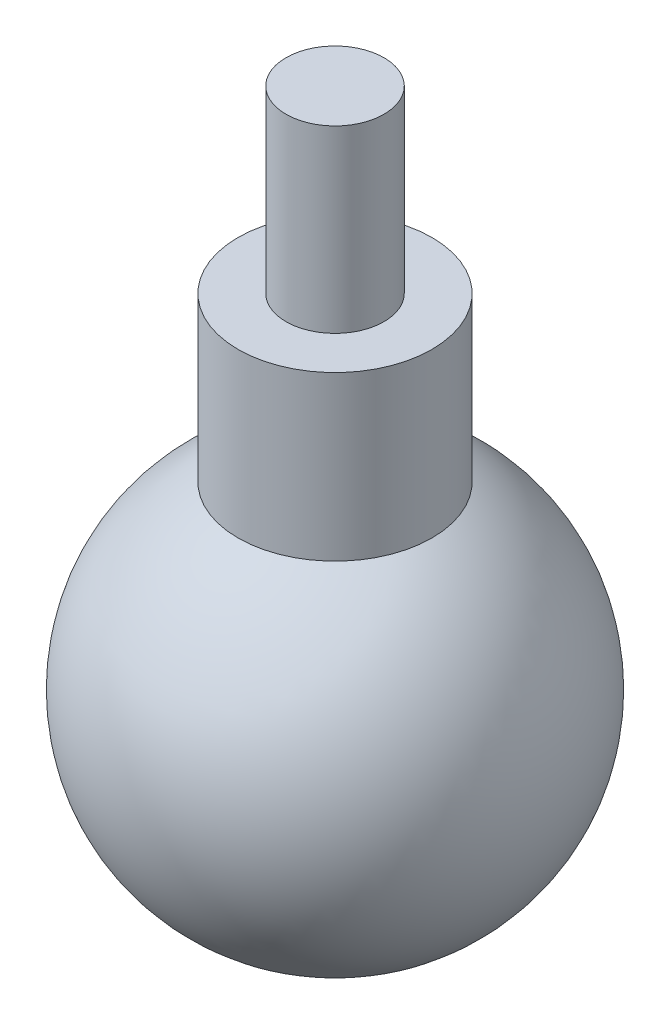
ISO-10303-21;
HEADER;
FILE_DESCRIPTION(('STEP AP214'),'2;1');
FILE_NAME('part.step','',(''),(''),'','','');
FILE_SCHEMA(('AUTOMOTIVE_DESIGN { 1 0 10303 214 1 1 1 1 }'));
ENDSEC;
DATA;
#1=APPLICATION_CONTEXT('core data for automotive mechanical design processes');
#2=APPLICATION_PROTOCOL_DEFINITION('international standard','automotive_design',2000,#1);
#3=PRODUCT_CONTEXT('',#1,'mechanical');
#4=PRODUCT('Part','Part','',(#3));
#5=PRODUCT_RELATED_PRODUCT_CATEGORY('part','',(#4));
#6=PRODUCT_DEFINITION_FORMATION('','',#4);
#7=PRODUCT_DEFINITION_CONTEXT('part definition',#1,'design');
#8=PRODUCT_DEFINITION('design','',#6,#7);
#9=PRODUCT_DEFINITION_SHAPE('','',#8);
#10=(LENGTH_UNIT() NAMED_UNIT(*) SI_UNIT(.MILLI.,.METRE.));
#11=(NAMED_UNIT(*) PLANE_ANGLE_UNIT() SI_UNIT($,.RADIAN.));
#12=(NAMED_UNIT(*) SI_UNIT($,.STERADIAN.) SOLID_ANGLE_UNIT());
#13=UNCERTAINTY_MEASURE_WITH_UNIT(LENGTH_MEASURE(1.E-05),#10,'distance_accuracy_value','');
#14=(GEOMETRIC_REPRESENTATION_CONTEXT(3) GLOBAL_UNCERTAINTY_ASSIGNED_CONTEXT((#13)) GLOBAL_UNIT_ASSIGNED_CONTEXT((#10,
#11,#12)) REPRESENTATION_CONTEXT('',''));
#15=CARTESIAN_POINT('',(0.,0.,0.));
#16=DIRECTION('',(0.,0.,1.));
#17=DIRECTION('',(1.,0.,0.));
#18=AXIS2_PLACEMENT_3D('',#15,#16,#17);
#19=CARTESIAN_POINT('',(0.,10.3161073825503,0.));
#20=DIRECTION('',(0.,1.,0.));
#21=DIRECTION('',(-1.,0.,0.));
#22=AXIS2_PLACEMENT_3D('',#19,#20,#21);
#23=PLANE('',#22);
#24=CARTESIAN_POINT('',(0.,10.3161073825503,0.));
#25=DIRECTION('',(0.,1.,0.));
#26=DIRECTION('',(-1.,0.,0.));
#27=AXIS2_PLACEMENT_3D('',#24,#25,#26);
#28=CIRCLE('',#27,5.93717104351896);
#29=CARTESIAN_POINT('',(-5.93717104351896,10.3161073825503,0.));
#30=VERTEX_POINT('',#29);
#31=EDGE_CURVE('E44',#30,#30,#28,.T.);
#32=ORIENTED_EDGE('',*,*,#31,.T.);
#33=EDGE_LOOP('',(#32));
#34=FACE_BOUND('',#33,.T.);
#35=CARTESIAN_POINT('',(0.,10.3161073825503,0.));
#36=DIRECTION('',(0.,1.,0.));
#37=DIRECTION('',(-1.,0.,0.));
#38=AXIS2_PLACEMENT_3D('',#35,#36,#37);
#39=CIRCLE('',#38,3.);
#40=CARTESIAN_POINT('',(-3.,10.3161073825503,0.));
#41=VERTEX_POINT('',#40);
#42=EDGE_CURVE('E51',#41,#41,#39,.T.);
#43=ORIENTED_EDGE('',*,*,#42,.F.);
#44=EDGE_LOOP('',(#43));
#45=FACE_BOUND('',#44,.T.);
#46=ADVANCED_FACE('F33',(#34,#45),#23,.T.);
#47=CARTESIAN_POINT('',(0.,-10.6838926174497,0.));
#48=DIRECTION('',(0.,-1.,0.));
#49=DIRECTION('',(-1.,0.,0.));
#50=AXIS2_PLACEMENT_3D('',#47,#48,#49);
#51=SPHERICAL_SURFACE('',#50,12.5);
#52=CARTESIAN_POINT('',(0.,-21.6838926174497,0.));
#53=DIRECTION('',(0.,-1.,0.));
#54=DIRECTION('',(1.,0.,0.));
#55=AXIS2_PLACEMENT_3D('',#52,#53,#54);
#56=CIRCLE('',#55,5.93717104351896);
#57=CARTESIAN_POINT('',(-5.93717104351896,-21.6838926174497,0.));
#58=VERTEX_POINT('',#57);
#59=EDGE_CURVE('E11',#58,#58,#56,.T.);
#60=CARTESIAN_POINT('',(0.,0.316107382550329,0.));
#61=DIRECTION('',(0.,1.,0.));
#62=DIRECTION('',(-1.,0.,0.));
#63=AXIS2_PLACEMENT_3D('',#60,#61,#62);
#64=CIRCLE('',#63,5.93717104351896);
#65=CARTESIAN_POINT('',(-5.93717104351896,0.316107382550328,0.));
#66=VERTEX_POINT('',#65);
#67=EDGE_CURVE('E40',#66,#66,#64,.T.);
#68=CARTESIAN_POINT('',(-5.93717104351896,-21.6838926174497,0.));
#69=CARTESIAN_POINT('',(-6.18373092228106,-21.5508310337295,0.));
#70=CARTESIAN_POINT('',(-6.42580093613342,-21.4094546711182,0.));
#71=CARTESIAN_POINT('',(-6.89990293129508,-21.1107681641525,0.));
#72=CARTESIAN_POINT('',(-7.13193491260439,-20.953458019798,0.));
#73=CARTESIAN_POINT('',(-7.58490253995636,-20.623599725385,0.));
#74=CARTESIAN_POINT('',(-7.80583818599903,-20.4510515753263,0.));
#75=CARTESIAN_POINT('',(-8.23561714877151,-20.0915012133809,0.));
#76=CARTESIAN_POINT('',(-8.44446046550133,-19.904499001494,0.));
#77=CARTESIAN_POINT('',(-8.84911017197232,-19.5168846172929,0.));
#78=CARTESIAN_POINT('',(-9.0449165617135,-19.3162724449787,0.));
#79=CARTESIAN_POINT('',(-9.42260761234344,-18.9023451397075,0.));
#80=CARTESIAN_POINT('',(-9.60449227323219,-18.6890300067507,0.));
#81=CARTESIAN_POINT('',(-9.95351775247681,-18.2506608223355,0.));
#82=CARTESIAN_POINT('',(-10.1206585708327,-18.0256067708771,0.));
#83=CARTESIAN_POINT('',(-10.4394409517533,-17.5647769474697,0.));
#84=CARTESIAN_POINT('',(-10.591082514318,-17.3290011755206,0.));
#85=CARTESIAN_POINT('',(-10.8781810056068,-16.8477935414592,0.));
#86=CARTESIAN_POINT('',(-11.013637934331,-16.6023616793467,0.));
#87=CARTESIAN_POINT('',(-11.267754934092,-16.1029511450666,0.));
#88=CARTESIAN_POINT('',(-11.3864150051288,-15.8489724728988,0.));
#89=CARTESIAN_POINT('',(-11.606401981235,-15.3336162257271,0.));
#90=CARTESIAN_POINT('',(-11.7077288863044,-15.0722386507232,0.));
#91=CARTESIAN_POINT('',(-11.8925915632438,-14.5432659464385,0.));
#92=CARTESIAN_POINT('',(-11.9761273351138,-14.2756708171579,0.));
#93=CARTESIAN_POINT('',(-12.125030188936,-13.7354724542272,0.));
#94=CARTESIAN_POINT('',(-12.1903972708881,-13.4628692205773,0.));
#95=CARTESIAN_POINT('',(-12.3026673052229,-12.9138867339861,0.));
#96=CARTESIAN_POINT('',(-12.3495702576055,-12.6375074810449,0.));
#97=CARTESIAN_POINT('',(-12.4247000454856,-12.0822221074168,0.));
#98=CARTESIAN_POINT('',(-12.452926880983,-11.8033159867299,0.));
#99=CARTESIAN_POINT('',(-12.4905768582402,-11.2442374498453,0.));
#100=CARTESIAN_POINT('',(-12.5,-10.9640650336475,0.));
#101=CARTESIAN_POINT('',(-12.5,-10.4037202012519,0.));
#102=CARTESIAN_POINT('',(-12.4905768582402,-10.1235477850541,0.));
#103=CARTESIAN_POINT('',(-12.452926880983,-9.56446924816945,0.));
#104=CARTESIAN_POINT('',(-12.4247000454856,-9.28556312748259,0.));
#105=CARTESIAN_POINT('',(-12.3495702576055,-8.73027775385447,0.));
#106=CARTESIAN_POINT('',(-12.3026673052229,-8.45389850091322,0.));
#107=CARTESIAN_POINT('',(-12.1903972708881,-7.90491601432203,0.));
#108=CARTESIAN_POINT('',(-12.125030188936,-7.6323127806721,0.));
#109=CARTESIAN_POINT('',(-11.9761273351138,-7.09211441774149,0.));
#110=CARTESIAN_POINT('',(-11.8925915632438,-6.82451928846081,0.));
#111=CARTESIAN_POINT('',(-11.7077288863044,-6.29554658417618,0.));
#112=CARTESIAN_POINT('',(-11.606401981235,-6.03416900917224,0.));
#113=CARTESIAN_POINT('',(-11.3864150051288,-5.51881276200053,0.));
#114=CARTESIAN_POINT('',(-11.267754934092,-5.26483408983277,0.));
#115=CARTESIAN_POINT('',(-11.013637934331,-4.7654235555526,0.));
#116=CARTESIAN_POINT('',(-10.8781810056068,-4.5199916934402,0.));
#117=CARTESIAN_POINT('',(-10.591082514318,-4.03878405937873,0.));
#118=CARTESIAN_POINT('',(-10.4394409517533,-3.80300828742967,0.));
#119=CARTESIAN_POINT('',(-10.1206585708327,-3.34217846402225,0.));
#120=CARTESIAN_POINT('',(-9.95351775247681,-3.11712441256388,0.));
#121=CARTESIAN_POINT('',(-9.60449227323219,-2.67875522814867,0.));
#122=CARTESIAN_POINT('',(-9.42260761234344,-2.46544009519182,0.));
#123=CARTESIAN_POINT('',(-9.04491656171351,-2.0515127899207,0.));
#124=CARTESIAN_POINT('',(-8.84911017197233,-1.85090061760642,0.));
#125=CARTESIAN_POINT('',(-8.44446046550133,-1.46328623340532,0.));
#126=CARTESIAN_POINT('',(-8.23561714877152,-1.27628402151848,0.));
#127=CARTESIAN_POINT('',(-7.80583818599903,-0.916733659573023,0.));
#128=CARTESIAN_POINT('',(-7.58490253995636,-0.744185509514395,0.));
#129=CARTESIAN_POINT('',(-7.13193491260439,-0.414327215101328,0.));
#130=CARTESIAN_POINT('',(-6.89990293129509,-0.25701707074689,0.));
#131=CARTESIAN_POINT('',(-6.42580093613343,0.0416694362188282,0.));
#132=CARTESIAN_POINT('',(-6.18373092228107,0.183045798830109,0.));
#133=CARTESIAN_POINT('',(-5.93717104351896,0.316107382550328,0.));
#134=B_SPLINE_CURVE_WITH_KNOTS('',3,(#68,#69,#70,#71,#72,#73,#74,#75,#76,#77,#78,#79,#80,#81,
#82,#83,#84,#85,#86,#87,#88,#89,#90,#91,#92,#93,#94,#95,#96,#97,#98,#99,#100,#101,#102,#103,
#104,#105,#106,#107,#108,#109,#110,#111,#112,#113,#114,#115,#116,#117,#118,#119,#120,#121,#122,
#123,#124,#125,#126,#127,#128,#129,#130,#131,#132,#133),.UNSPECIFIED.,.F.,.F.,(4,2,2,2,2,2,2,2,
2,2,2,2,2,2,2,2,2,2,2,2,2,2,2,2,2,2,2,2,2,2,2,2,4),(0.,0.840359006443516,1.68071801288703,
2.52107701933055,3.36143602577406,4.20179503221758,5.0421540386611,5.88251304510461,
6.72287205154813,7.56323105799164,8.40359006443516,9.24394907087868,10.0843080773222,
10.9246670837657,11.7650260902092,12.6053850966527,13.4457441030963,14.2861031095398,
15.1264621159833,15.9668211224268,16.8071801288703,17.6475391353138,18.4878981417574,
19.3282571482009,20.1686161546444,21.0089751610879,21.8493341675314,22.6896931739749,
23.5300521804184,24.370411186862,25.2107701933055,26.051129199749,26.8914882061925),.UNSPECIFIED.);
#135=EDGE_CURVE('BSEAM35',#58,#66,#134,.T.);
#136=ORIENTED_EDGE('',*,*,#59,.F.);
#137=ORIENTED_EDGE('',*,*,#67,.F.);
#138=ORIENTED_EDGE('',*,*,#135,.T.);
#139=ORIENTED_EDGE('',*,*,#135,.F.);
#140=EDGE_LOOP('',(#136,#138,#137,#139));
#141=FACE_BOUND('',#140,.T.);
#142=ADVANCED_FACE('F35',(#141),#51,.T.);
#143=CARTESIAN_POINT('',(15.0983407904549,-21.6838926174497,-10.));
#144=DIRECTION('',(0.,-1.,0.));
#145=DIRECTION('',(1.,0.,0.));
#146=AXIS2_PLACEMENT_3D('',#143,#144,#145);
#147=PLANE('',#146);
#148=ORIENTED_EDGE('',*,*,#59,.T.);
#149=EDGE_LOOP('',(#148));
#150=FACE_BOUND('',#149,.T.);
#151=ADVANCED_FACE('F72',(#150),#147,.T.);
#152=CARTESIAN_POINT('',(0.,10.3161073825503,0.));
#153=DIRECTION('',(0.,-1.,0.));
#154=DIRECTION('',(1.,0.,0.));
#155=AXIS2_PLACEMENT_3D('',#152,#153,#154);
#156=CYLINDRICAL_SURFACE('',#155,5.93717104351896);
#157=ORIENTED_EDGE('',*,*,#31,.F.);
#158=EDGE_LOOP('',(#157));
#159=FACE_BOUND('',#158,.T.);
#160=ORIENTED_EDGE('',*,*,#67,.T.);
#161=EDGE_LOOP('',(#160));
#162=FACE_BOUND('',#161,.T.);
#163=ADVANCED_FACE('F62',(#159,#162),#156,.T.);
#164=CARTESIAN_POINT('',(0.,21.3161073825503,0.));
#165=DIRECTION('',(0.,-1.,0.));
#166=DIRECTION('',(1.,0.,0.));
#167=AXIS2_PLACEMENT_3D('',#164,#165,#166);
#168=CYLINDRICAL_SURFACE('',#167,3.);
#169=CARTESIAN_POINT('',(0.,21.3161073825503,0.));
#170=DIRECTION('',(0.,1.,0.));
#171=DIRECTION('',(-1.,0.,0.));
#172=AXIS2_PLACEMENT_3D('',#169,#170,#171);
#173=CIRCLE('',#172,3.);
#174=CARTESIAN_POINT('',(-3.,21.3161073825503,0.));
#175=VERTEX_POINT('',#174);
#176=EDGE_CURVE('E48',#175,#175,#173,.T.);
#177=ORIENTED_EDGE('',*,*,#176,.F.);
#178=EDGE_LOOP('',(#177));
#179=FACE_BOUND('',#178,.T.);
#180=ORIENTED_EDGE('',*,*,#42,.T.);
#181=EDGE_LOOP('',(#180));
#182=FACE_BOUND('',#181,.T.);
#183=ADVANCED_FACE('F59',(#179,#182),#168,.T.);
#184=CARTESIAN_POINT('',(0.,21.3161073825503,0.));
#185=DIRECTION('',(0.,1.,0.));
#186=DIRECTION('',(-1.,0.,0.));
#187=AXIS2_PLACEMENT_3D('',#184,#185,#186);
#188=PLANE('',#187);
#189=ORIENTED_EDGE('',*,*,#176,.T.);
#190=EDGE_LOOP('',(#189));
#191=FACE_BOUND('',#190,.T.);
#192=ADVANCED_FACE('F57',(#191),#188,.T.);
#193=CLOSED_SHELL('',(#46,#142,#151,#163,#183,#192));
#194=MANIFOLD_SOLID_BREP('B2',#193);
#195=ADVANCED_BREP_SHAPE_REPRESENTATION('',(#18,#194),#14);
#196=SHAPE_DEFINITION_REPRESENTATION(#9,#195);
ENDSEC;
END-ISO-10303-21;
